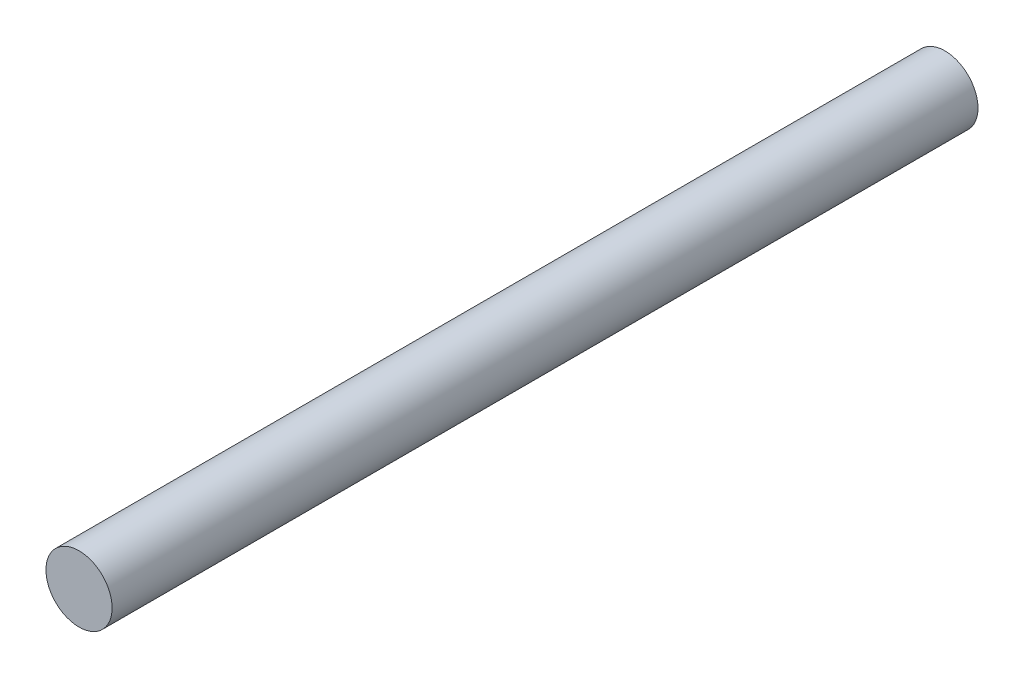
ISO-10303-21;
HEADER;
FILE_DESCRIPTION(('STEP AP214'),'2;1');
FILE_NAME('part.step','',(''),(''),'','','');
FILE_SCHEMA(('AUTOMOTIVE_DESIGN { 1 0 10303 214 1 1 1 1 }'));
ENDSEC;
DATA;
#1=APPLICATION_CONTEXT('core data for automotive mechanical design processes');
#2=APPLICATION_PROTOCOL_DEFINITION('international standard','automotive_design',2000,#1);
#3=PRODUCT_CONTEXT('',#1,'mechanical');
#4=PRODUCT('Part','Part','',(#3));
#5=PRODUCT_RELATED_PRODUCT_CATEGORY('part','',(#4));
#6=PRODUCT_DEFINITION_FORMATION('','',#4);
#7=PRODUCT_DEFINITION_CONTEXT('part definition',#1,'design');
#8=PRODUCT_DEFINITION('design','',#6,#7);
#9=PRODUCT_DEFINITION_SHAPE('','',#8);
#10=(LENGTH_UNIT() NAMED_UNIT(*) SI_UNIT(.MILLI.,.METRE.));
#11=(NAMED_UNIT(*) PLANE_ANGLE_UNIT() SI_UNIT($,.RADIAN.));
#12=(NAMED_UNIT(*) SI_UNIT($,.STERADIAN.) SOLID_ANGLE_UNIT());
#13=UNCERTAINTY_MEASURE_WITH_UNIT(LENGTH_MEASURE(1.E-05),#10,'distance_accuracy_value','');
#14=(GEOMETRIC_REPRESENTATION_CONTEXT(3) GLOBAL_UNCERTAINTY_ASSIGNED_CONTEXT((#13)) GLOBAL_UNIT_ASSIGNED_CONTEXT((#10,
#11,#12)) REPRESENTATION_CONTEXT('',''));
#15=CARTESIAN_POINT('',(0.,0.,0.));
#16=DIRECTION('',(0.,0.,1.));
#17=DIRECTION('',(1.,0.,0.));
#18=AXIS2_PLACEMENT_3D('',#15,#16,#17);
#19=CARTESIAN_POINT('',(0.,0.,39.25));
#20=DIRECTION('',(0.,0.,-1.));
#21=DIRECTION('',(-1.,0.,0.));
#22=AXIS2_PLACEMENT_3D('',#19,#20,#21);
#23=CYLINDRICAL_SURFACE('',#22,3.);
#24=CARTESIAN_POINT('',(0.,0.,39.25));
#25=DIRECTION('',(0.,0.,1.));
#26=DIRECTION('',(1.,0.,0.));
#27=AXIS2_PLACEMENT_3D('',#24,#25,#26);
#28=CIRCLE('',#27,3.);
#29=CARTESIAN_POINT('',(3.,0.,39.25));
#30=VERTEX_POINT('',#29);
#31=EDGE_CURVE('E10',#30,#30,#28,.T.);
#32=ORIENTED_EDGE('',*,*,#31,.F.);
#33=EDGE_LOOP('',(#32));
#34=FACE_BOUND('',#33,.T.);
#35=CARTESIAN_POINT('',(0.,0.,-39.25));
#36=DIRECTION('',(0.,0.,1.));
#37=DIRECTION('',(1.,0.,0.));
#38=AXIS2_PLACEMENT_3D('',#35,#36,#37);
#39=CIRCLE('',#38,3.);
#40=CARTESIAN_POINT('',(3.,0.,-39.25));
#41=VERTEX_POINT('',#40);
#42=EDGE_CURVE('E39',#41,#41,#39,.T.);
#43=ORIENTED_EDGE('',*,*,#42,.T.);
#44=EDGE_LOOP('',(#43));
#45=FACE_BOUND('',#44,.T.);
#46=ADVANCED_FACE('F36',(#34,#45),#23,.T.);
#47=CARTESIAN_POINT('',(0.,0.,39.25));
#48=DIRECTION('',(0.,0.,1.));
#49=DIRECTION('',(1.,0.,0.));
#50=AXIS2_PLACEMENT_3D('',#47,#48,#49);
#51=PLANE('',#50);
#52=ORIENTED_EDGE('',*,*,#31,.T.);
#53=EDGE_LOOP('',(#52));
#54=FACE_BOUND('',#53,.T.);
#55=ADVANCED_FACE('F51',(#54),#51,.T.);
#56=CARTESIAN_POINT('',(0.,0.,-39.25));
#57=DIRECTION('',(0.,0.,1.));
#58=DIRECTION('',(1.,0.,0.));
#59=AXIS2_PLACEMENT_3D('',#56,#57,#58);
#60=PLANE('',#59);
#61=ORIENTED_EDGE('',*,*,#42,.F.);
#62=EDGE_LOOP('',(#61));
#63=FACE_BOUND('',#62,.T.);
#64=ADVANCED_FACE('F49',(#63),#60,.F.);
#65=CLOSED_SHELL('',(#46,#55,#64));
#66=MANIFOLD_SOLID_BREP('B2',#65);
#67=ADVANCED_BREP_SHAPE_REPRESENTATION('',(#18,#66),#14);
#68=SHAPE_DEFINITION_REPRESENTATION(#9,#67);
ENDSEC;
END-ISO-10303-21;
